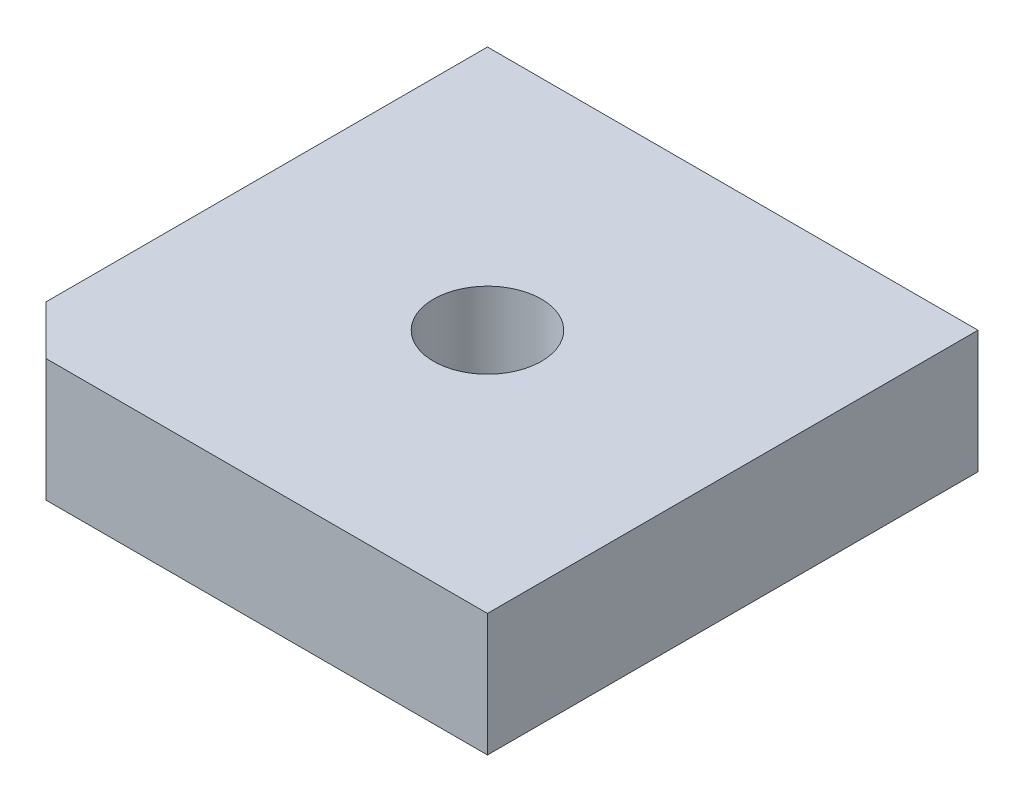
ISO-10303-21;
HEADER;
FILE_DESCRIPTION(('STEP AP214'),'2;1');
FILE_NAME('part.step','',(''),(''),'','','');
FILE_SCHEMA(('AUTOMOTIVE_DESIGN { 1 0 10303 214 1 1 1 1 }'));
ENDSEC;
DATA;
#1=APPLICATION_CONTEXT('core data for automotive mechanical design processes');
#2=APPLICATION_PROTOCOL_DEFINITION('international standard','automotive_design',2000,#1);
#3=PRODUCT_CONTEXT('',#1,'mechanical');
#4=PRODUCT('Part','Part','',(#3));
#5=PRODUCT_RELATED_PRODUCT_CATEGORY('part','',(#4));
#6=PRODUCT_DEFINITION_FORMATION('','',#4);
#7=PRODUCT_DEFINITION_CONTEXT('part definition',#1,'design');
#8=PRODUCT_DEFINITION('design','',#6,#7);
#9=PRODUCT_DEFINITION_SHAPE('','',#8);
#10=(LENGTH_UNIT() NAMED_UNIT(*) SI_UNIT(.MILLI.,.METRE.));
#11=(NAMED_UNIT(*) PLANE_ANGLE_UNIT() SI_UNIT($,.RADIAN.));
#12=(NAMED_UNIT(*) SI_UNIT($,.STERADIAN.) SOLID_ANGLE_UNIT());
#13=UNCERTAINTY_MEASURE_WITH_UNIT(LENGTH_MEASURE(1.E-05),#10,'distance_accuracy_value','');
#14=(GEOMETRIC_REPRESENTATION_CONTEXT(3) GLOBAL_UNCERTAINTY_ASSIGNED_CONTEXT((#13)) GLOBAL_UNIT_ASSIGNED_CONTEXT((#10,
#11,#12)) REPRESENTATION_CONTEXT('',''));
#15=CARTESIAN_POINT('',(0.,0.,0.));
#16=DIRECTION('',(0.,0.,1.));
#17=DIRECTION('',(1.,0.,0.));
#18=AXIS2_PLACEMENT_3D('',#15,#16,#17);
#19=CARTESIAN_POINT('',(0.,-25.,0.));
#20=DIRECTION('',(0.,-1.,0.));
#21=DIRECTION('',(0.,0.,-1.));
#22=AXIS2_PLACEMENT_3D('',#19,#20,#21);
#23=PLANE('',#22);
#24=CARTESIAN_POINT('',(-1225.,-25.,875.));
#25=DIRECTION('',(0.,-1.,0.));
#26=DIRECTION('',(0.,0.,-1.));
#27=AXIS2_PLACEMENT_3D('',#24,#25,#26);
#28=CIRCLE('',#27,10.9999999999999);
#29=CARTESIAN_POINT('',(-1225.,-25.,864.));
#30=VERTEX_POINT('',#29);
#31=EDGE_CURVE('E52',#30,#30,#28,.F.);
#32=ORIENTED_EDGE('',*,*,#31,.T.);
#33=EDGE_LOOP('',(#32));
#34=FACE_BOUND('',#33,.T.);
#35=DIRECTION('',(1.,0.,0.));
#36=VECTOR('',#35,1.);
#37=CARTESIAN_POINT('',(-1175.,-25.,925.));
#38=LINE('',#37,#36);
#39=CARTESIAN_POINT('',(-1265.,-25.,925.));
#40=VERTEX_POINT('',#39);
#41=CARTESIAN_POINT('',(-1175.,-25.,925.));
#42=VERTEX_POINT('',#41);
#43=EDGE_CURVE('E107',#40,#42,#38,.T.);
#44=ORIENTED_EDGE('',*,*,#43,.F.);
#45=DIRECTION('',(0.707106781186544,0.,0.707106781186552));
#46=VECTOR('',#45,1.);
#47=CARTESIAN_POINT('',(-1265.,-25.,925.));
#48=LINE('',#47,#46);
#49=CARTESIAN_POINT('',(-1275.,-25.,915.));
#50=VERTEX_POINT('',#49);
#51=EDGE_CURVE('E102',#50,#40,#48,.T.);
#52=ORIENTED_EDGE('',*,*,#51,.F.);
#53=DIRECTION('',(0.,0.,1.));
#54=VECTOR('',#53,1.);
#55=CARTESIAN_POINT('',(-1275.,-25.,915.));
#56=LINE('',#55,#54);
#57=CARTESIAN_POINT('',(-1275.,-25.,825.));
#58=VERTEX_POINT('',#57);
#59=EDGE_CURVE('E158',#58,#50,#56,.T.);
#60=ORIENTED_EDGE('',*,*,#59,.F.);
#61=DIRECTION('',(-1.,0.,0.));
#62=VECTOR('',#61,1.);
#63=CARTESIAN_POINT('',(-1275.,-25.,825.));
#64=LINE('',#63,#62);
#65=CARTESIAN_POINT('',(-1175.,-25.,825.));
#66=VERTEX_POINT('',#65);
#67=EDGE_CURVE('E121',#66,#58,#64,.T.);
#68=ORIENTED_EDGE('',*,*,#67,.F.);
#69=DIRECTION('',(0.,0.,-1.));
#70=VECTOR('',#69,1.);
#71=CARTESIAN_POINT('',(-1175.,-25.,825.));
#72=LINE('',#71,#70);
#73=EDGE_CURVE('E117',#42,#66,#72,.T.);
#74=ORIENTED_EDGE('',*,*,#73,.F.);
#75=EDGE_LOOP('',(#44,#52,#60,#68,#74));
#76=FACE_BOUND('',#75,.T.);
#77=ADVANCED_FACE('F49',(#34,#76),#23,.T.);
#78=CARTESIAN_POINT('',(-1175.,0.,825.));
#79=DIRECTION('',(1.,0.,0.));
#80=DIRECTION('',(0.,0.,-1.));
#81=AXIS2_PLACEMENT_3D('',#78,#79,#80);
#82=PLANE('',#81);
#83=ORIENTED_EDGE('',*,*,#73,.T.);
#84=DIRECTION('',(0.,1.,0.));
#85=VECTOR('',#84,1.);
#86=CARTESIAN_POINT('',(-1175.,0.,825.));
#87=LINE('',#86,#85);
#88=CARTESIAN_POINT('',(-1175.,0.,825.));
#89=VERTEX_POINT('',#88);
#90=EDGE_CURVE('E151',#89,#66,#87,.F.);
#91=ORIENTED_EDGE('',*,*,#90,.F.);
#92=DIRECTION('',(0.,0.,-1.));
#93=VECTOR('',#92,1.);
#94=CARTESIAN_POINT('',(-1175.,0.,0.));
#95=LINE('',#94,#93);
#96=CARTESIAN_POINT('',(-1175.,0.,925.));
#97=VERTEX_POINT('',#96);
#98=EDGE_CURVE('E129',#89,#97,#95,.F.);
#99=ORIENTED_EDGE('',*,*,#98,.T.);
#100=DIRECTION('',(0.,1.,0.));
#101=VECTOR('',#100,1.);
#102=CARTESIAN_POINT('',(-1175.,0.,925.));
#103=LINE('',#102,#101);
#104=EDGE_CURVE('E112',#42,#97,#103,.T.);
#105=ORIENTED_EDGE('',*,*,#104,.F.);
#106=EDGE_LOOP('',(#83,#91,#99,#105));
#107=FACE_BOUND('',#106,.T.);
#108=ADVANCED_FACE('F128',(#107),#82,.T.);
#109=CARTESIAN_POINT('',(-1175.,0.,925.));
#110=DIRECTION('',(0.,0.,1.));
#111=DIRECTION('',(1.,0.,0.));
#112=AXIS2_PLACEMENT_3D('',#109,#110,#111);
#113=PLANE('',#112);
#114=ORIENTED_EDGE('',*,*,#43,.T.);
#115=ORIENTED_EDGE('',*,*,#104,.T.);
#116=DIRECTION('',(1.,0.,0.));
#117=VECTOR('',#116,1.);
#118=CARTESIAN_POINT('',(0.,0.,925.));
#119=LINE('',#118,#117);
#120=CARTESIAN_POINT('',(-1265.,0.,925.));
#121=VERTEX_POINT('',#120);
#122=EDGE_CURVE('E171',#97,#121,#119,.F.);
#123=ORIENTED_EDGE('',*,*,#122,.T.);
#124=DIRECTION('',(0.,1.,0.));
#125=VECTOR('',#124,1.);
#126=CARTESIAN_POINT('',(-1265.,0.,925.));
#127=LINE('',#126,#125);
#128=EDGE_CURVE('E114',#40,#121,#127,.T.);
#129=ORIENTED_EDGE('',*,*,#128,.F.);
#130=EDGE_LOOP('',(#114,#115,#123,#129));
#131=FACE_BOUND('',#130,.T.);
#132=ADVANCED_FACE('F109',(#131),#113,.T.);
#133=CARTESIAN_POINT('',(-1265.,0.,925.));
#134=DIRECTION('',(-0.707106781186552,0.,0.707106781186544));
#135=DIRECTION('',(0.707106781186544,0.,0.707106781186552));
#136=AXIS2_PLACEMENT_3D('',#133,#134,#135);
#137=PLANE('',#136);
#138=ORIENTED_EDGE('',*,*,#51,.T.);
#139=ORIENTED_EDGE('',*,*,#128,.T.);
#140=DIRECTION('',(-0.707106781186547,0.,-0.707106781186547));
#141=VECTOR('',#140,1.);
#142=CARTESIAN_POINT('',(-1265.,0.,925.));
#143=LINE('',#142,#141);
#144=CARTESIAN_POINT('',(-1275.,0.,915.));
#145=VERTEX_POINT('',#144);
#146=EDGE_CURVE('E167',#121,#145,#143,.T.);
#147=ORIENTED_EDGE('',*,*,#146,.T.);
#148=DIRECTION('',(0.,1.,0.));
#149=VECTOR('',#148,1.);
#150=CARTESIAN_POINT('',(-1275.,0.,915.));
#151=LINE('',#150,#149);
#152=EDGE_CURVE('E156',#50,#145,#151,.T.);
#153=ORIENTED_EDGE('',*,*,#152,.F.);
#154=EDGE_LOOP('',(#138,#139,#147,#153));
#155=FACE_BOUND('',#154,.T.);
#156=ADVANCED_FACE('F166',(#155),#137,.T.);
#157=CARTESIAN_POINT('',(-1275.,0.,915.));
#158=DIRECTION('',(-1.,0.,0.));
#159=DIRECTION('',(0.,0.,1.));
#160=AXIS2_PLACEMENT_3D('',#157,#158,#159);
#161=PLANE('',#160);
#162=ORIENTED_EDGE('',*,*,#59,.T.);
#163=ORIENTED_EDGE('',*,*,#152,.T.);
#164=DIRECTION('',(0.,0.,-1.));
#165=VECTOR('',#164,1.);
#166=CARTESIAN_POINT('',(-1275.,0.,0.));
#167=LINE('',#166,#165);
#168=CARTESIAN_POINT('',(-1275.,0.,825.));
#169=VERTEX_POINT('',#168);
#170=EDGE_CURVE('E173',#145,#169,#167,.T.);
#171=ORIENTED_EDGE('',*,*,#170,.T.);
#172=DIRECTION('',(0.,1.,0.));
#173=VECTOR('',#172,1.);
#174=CARTESIAN_POINT('',(-1275.,0.,825.));
#175=LINE('',#174,#173);
#176=EDGE_CURVE('E71',#58,#169,#175,.T.);
#177=ORIENTED_EDGE('',*,*,#176,.F.);
#178=EDGE_LOOP('',(#162,#163,#171,#177));
#179=FACE_BOUND('',#178,.T.);
#180=ADVANCED_FACE('F182',(#179),#161,.T.);
#181=CARTESIAN_POINT('',(-1275.,0.,825.));
#182=DIRECTION('',(0.,0.,-1.));
#183=DIRECTION('',(-1.,0.,0.));
#184=AXIS2_PLACEMENT_3D('',#181,#182,#183);
#185=PLANE('',#184);
#186=ORIENTED_EDGE('',*,*,#67,.T.);
#187=ORIENTED_EDGE('',*,*,#176,.T.);
#188=DIRECTION('',(1.,0.,0.));
#189=VECTOR('',#188,1.);
#190=CARTESIAN_POINT('',(0.,0.,825.));
#191=LINE('',#190,#189);
#192=EDGE_CURVE('E59',#169,#89,#191,.T.);
#193=ORIENTED_EDGE('',*,*,#192,.T.);
#194=ORIENTED_EDGE('',*,*,#90,.T.);
#195=EDGE_LOOP('',(#186,#187,#193,#194));
#196=FACE_BOUND('',#195,.T.);
#197=ADVANCED_FACE('F180',(#196),#185,.T.);
#198=CARTESIAN_POINT('',(-1225.,0.,875.));
#199=DIRECTION('',(0.,-1.,0.));
#200=DIRECTION('',(0.,0.,-1.));
#201=AXIS2_PLACEMENT_3D('',#198,#199,#200);
#202=CYLINDRICAL_SURFACE('',#201,10.9999999999999);
#203=ORIENTED_EDGE('',*,*,#31,.F.);
#204=EDGE_LOOP('',(#203));
#205=FACE_BOUND('',#204,.T.);
#206=CARTESIAN_POINT('',(-1225.,0.,875.));
#207=DIRECTION('',(0.,-1.,0.));
#208=DIRECTION('',(0.,0.,-1.));
#209=AXIS2_PLACEMENT_3D('',#206,#207,#208);
#210=CIRCLE('',#209,10.9999999999999);
#211=CARTESIAN_POINT('',(-1225.,0.,864.));
#212=VERTEX_POINT('',#211);
#213=EDGE_CURVE('E12',#212,#212,#210,.F.);
#214=ORIENTED_EDGE('',*,*,#213,.T.);
#215=EDGE_LOOP('',(#214));
#216=FACE_BOUND('',#215,.T.);
#217=ADVANCED_FACE('F189',(#205,#216),#202,.F.);
#218=CARTESIAN_POINT('',(0.,0.,0.));
#219=DIRECTION('',(0.,-1.,0.));
#220=DIRECTION('',(0.,0.,-1.));
#221=AXIS2_PLACEMENT_3D('',#218,#219,#220);
#222=PLANE('',#221);
#223=ORIENTED_EDGE('',*,*,#213,.F.);
#224=EDGE_LOOP('',(#223));
#225=FACE_BOUND('',#224,.T.);
#226=ORIENTED_EDGE('',*,*,#170,.F.);
#227=ORIENTED_EDGE('',*,*,#146,.F.);
#228=ORIENTED_EDGE('',*,*,#122,.F.);
#229=ORIENTED_EDGE('',*,*,#98,.F.);
#230=ORIENTED_EDGE('',*,*,#192,.F.);
#231=EDGE_LOOP('',(#226,#227,#228,#229,#230));
#232=FACE_BOUND('',#231,.T.);
#233=ADVANCED_FACE('F170',(#225,#232),#222,.F.);
#234=CLOSED_SHELL('',(#77,#108,#132,#156,#180,#197,#217,#233));
#235=MANIFOLD_SOLID_BREP('B2',#234);
#236=ADVANCED_BREP_SHAPE_REPRESENTATION('',(#18,#235),#14);
#237=SHAPE_DEFINITION_REPRESENTATION(#9,#236);
ENDSEC;
END-ISO-10303-21;
